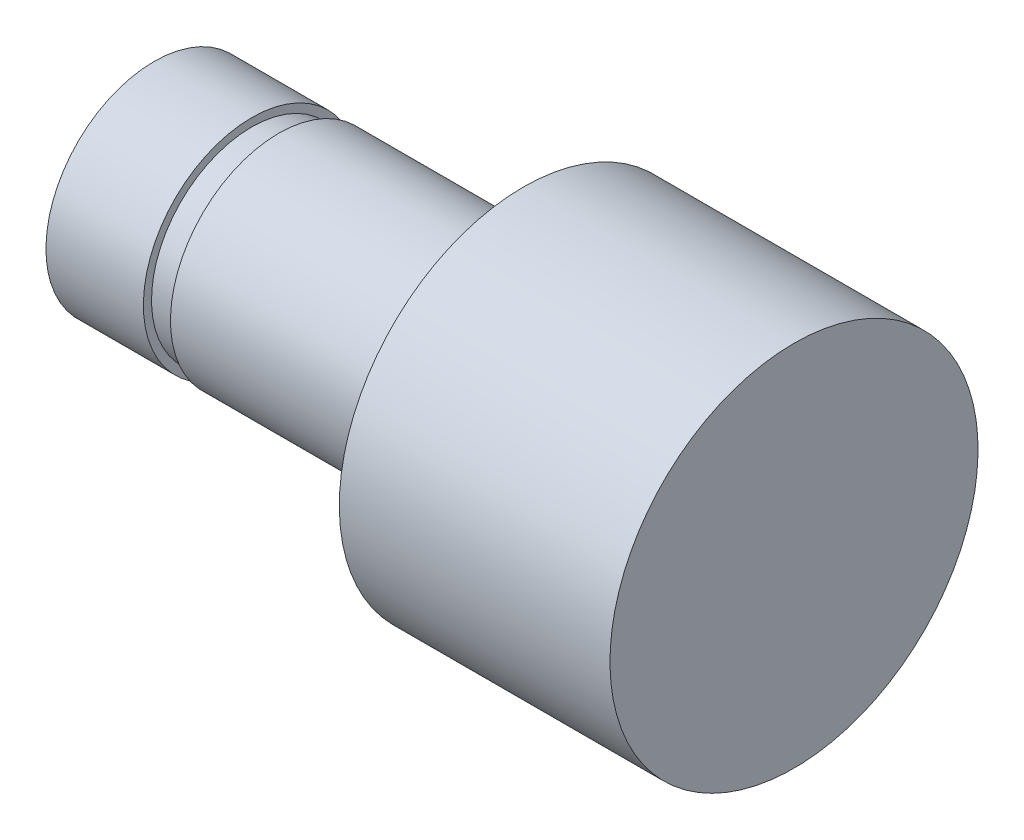
ISO-10303-21;
HEADER;
FILE_DESCRIPTION(('STEP AP214'),'2;1');
FILE_NAME('part.step','',(''),(''),'','','');
FILE_SCHEMA(('AUTOMOTIVE_DESIGN { 1 0 10303 214 1 1 1 1 }'));
ENDSEC;
DATA;
#1=APPLICATION_CONTEXT('core data for automotive mechanical design processes');
#2=APPLICATION_PROTOCOL_DEFINITION('international standard','automotive_design',2000,#1);
#3=PRODUCT_CONTEXT('',#1,'mechanical');
#4=PRODUCT('Part','Part','',(#3));
#5=PRODUCT_RELATED_PRODUCT_CATEGORY('part','',(#4));
#6=PRODUCT_DEFINITION_FORMATION('','',#4);
#7=PRODUCT_DEFINITION_CONTEXT('part definition',#1,'design');
#8=PRODUCT_DEFINITION('design','',#6,#7);
#9=PRODUCT_DEFINITION_SHAPE('','',#8);
#10=(LENGTH_UNIT() NAMED_UNIT(*) SI_UNIT(.MILLI.,.METRE.));
#11=(NAMED_UNIT(*) PLANE_ANGLE_UNIT() SI_UNIT($,.RADIAN.));
#12=(NAMED_UNIT(*) SI_UNIT($,.STERADIAN.) SOLID_ANGLE_UNIT());
#13=UNCERTAINTY_MEASURE_WITH_UNIT(LENGTH_MEASURE(1.E-05),#10,'distance_accuracy_value','');
#14=(GEOMETRIC_REPRESENTATION_CONTEXT(3) GLOBAL_UNCERTAINTY_ASSIGNED_CONTEXT((#13)) GLOBAL_UNIT_ASSIGNED_CONTEXT((#10,
#11,#12)) REPRESENTATION_CONTEXT('',''));
#15=CARTESIAN_POINT('',(0.,0.,0.));
#16=DIRECTION('',(0.,0.,1.));
#17=DIRECTION('',(1.,0.,0.));
#18=AXIS2_PLACEMENT_3D('',#15,#16,#17);
#19=CARTESIAN_POINT('',(2.65645161290323,3.4,0.));
#20=DIRECTION('',(1.,0.,0.));
#21=DIRECTION('',(0.,1.,0.));
#22=AXIS2_PLACEMENT_3D('',#19,#20,#21);
#23=PLANE('',#22);
#24=CARTESIAN_POINT('',(2.65645161290323,0.,0.));
#25=DIRECTION('',(1.,0.,0.));
#26=DIRECTION('',(0.,1.,0.));
#27=AXIS2_PLACEMENT_3D('',#24,#25,#26);
#28=CIRCLE('',#27,3.4);
#29=CARTESIAN_POINT('',(2.65645161290323,3.4,0.));
#30=VERTEX_POINT('',#29);
#31=EDGE_CURVE('E67',#30,#30,#28,.T.);
#32=ORIENTED_EDGE('',*,*,#31,.T.);
#33=EDGE_LOOP('',(#32));
#34=FACE_BOUND('',#33,.T.);
#35=ADVANCED_FACE('F39',(#34),#23,.T.);
#36=CARTESIAN_POINT('',(-9.16354838709677,0.,0.));
#37=DIRECTION('',(-1.,0.,0.));
#38=DIRECTION('',(0.,-1.,0.));
#39=AXIS2_PLACEMENT_3D('',#36,#37,#38);
#40=PLANE('',#39);
#41=CARTESIAN_POINT('',(-9.16354838709677,0.,0.));
#42=DIRECTION('',(1.,0.,0.));
#43=DIRECTION('',(0.,1.,0.));
#44=AXIS2_PLACEMENT_3D('',#41,#42,#43);
#45=CIRCLE('',#44,2.);
#46=CARTESIAN_POINT('',(-9.16354838709677,2.,0.));
#47=VERTEX_POINT('',#46);
#48=EDGE_CURVE('E10',#47,#47,#45,.T.);
#49=ORIENTED_EDGE('',*,*,#48,.F.);
#50=EDGE_LOOP('',(#49));
#51=FACE_BOUND('',#50,.T.);
#52=ADVANCED_FACE('F84',(#51),#40,.T.);
#53=CARTESIAN_POINT('',(2.65645161290323,0.,0.));
#54=DIRECTION('',(1.,0.,0.));
#55=DIRECTION('',(0.,1.,0.));
#56=AXIS2_PLACEMENT_3D('',#53,#54,#55);
#57=CYLINDRICAL_SURFACE('',#56,2.);
#58=ORIENTED_EDGE('',*,*,#48,.T.);
#59=EDGE_LOOP('',(#58));
#60=FACE_BOUND('',#59,.T.);
#61=CARTESIAN_POINT('',(-7.36354838709677,0.,0.));
#62=DIRECTION('',(1.,0.,0.));
#63=DIRECTION('',(0.,1.,0.));
#64=AXIS2_PLACEMENT_3D('',#61,#62,#63);
#65=CIRCLE('',#64,2.);
#66=CARTESIAN_POINT('',(-7.36354838709677,2.,0.));
#67=VERTEX_POINT('',#66);
#68=EDGE_CURVE('E45',#67,#67,#65,.T.);
#69=ORIENTED_EDGE('',*,*,#68,.F.);
#70=EDGE_LOOP('',(#69));
#71=FACE_BOUND('',#70,.T.);
#72=ADVANCED_FACE('F88',(#60,#71),#57,.T.);
#73=CARTESIAN_POINT('',(-7.36354838709677,2.,0.));
#74=DIRECTION('',(1.,0.,0.));
#75=DIRECTION('',(0.,1.,0.));
#76=AXIS2_PLACEMENT_3D('',#73,#74,#75);
#77=PLANE('',#76);
#78=ORIENTED_EDGE('',*,*,#68,.T.);
#79=EDGE_LOOP('',(#78));
#80=FACE_BOUND('',#79,.T.);
#81=CARTESIAN_POINT('',(-7.36354838709677,0.,0.));
#82=DIRECTION('',(1.,0.,0.));
#83=DIRECTION('',(0.,1.,0.));
#84=AXIS2_PLACEMENT_3D('',#81,#82,#83);
#85=CIRCLE('',#84,1.85);
#86=CARTESIAN_POINT('',(-7.36354838709677,1.85,0.));
#87=VERTEX_POINT('',#86);
#88=EDGE_CURVE('E49',#87,#87,#85,.T.);
#89=ORIENTED_EDGE('',*,*,#88,.F.);
#90=EDGE_LOOP('',(#89));
#91=FACE_BOUND('',#90,.T.);
#92=ADVANCED_FACE('F93',(#80,#91),#77,.T.);
#93=CARTESIAN_POINT('',(2.65645161290323,0.,0.));
#94=DIRECTION('',(1.,0.,0.));
#95=DIRECTION('',(0.,1.,0.));
#96=AXIS2_PLACEMENT_3D('',#93,#94,#95);
#97=CYLINDRICAL_SURFACE('',#96,1.85);
#98=ORIENTED_EDGE('',*,*,#88,.T.);
#99=EDGE_LOOP('',(#98));
#100=FACE_BOUND('',#99,.T.);
#101=CARTESIAN_POINT('',(-6.86354838709677,0.,0.));
#102=DIRECTION('',(1.,0.,0.));
#103=DIRECTION('',(0.,1.,0.));
#104=AXIS2_PLACEMENT_3D('',#101,#102,#103);
#105=CIRCLE('',#104,1.85);
#106=CARTESIAN_POINT('',(-6.86354838709677,1.85,0.));
#107=VERTEX_POINT('',#106);
#108=EDGE_CURVE('E53',#107,#107,#105,.T.);
#109=ORIENTED_EDGE('',*,*,#108,.F.);
#110=EDGE_LOOP('',(#109));
#111=FACE_BOUND('',#110,.T.);
#112=ADVANCED_FACE('F98',(#100,#111),#97,.T.);
#113=CARTESIAN_POINT('',(-6.86354838709677,1.85,0.));
#114=DIRECTION('',(-1.,0.,0.));
#115=DIRECTION('',(0.,-1.,0.));
#116=AXIS2_PLACEMENT_3D('',#113,#114,#115);
#117=PLANE('',#116);
#118=ORIENTED_EDGE('',*,*,#108,.T.);
#119=EDGE_LOOP('',(#118));
#120=FACE_BOUND('',#119,.T.);
#121=CARTESIAN_POINT('',(-6.86354838709677,0.,0.));
#122=DIRECTION('',(1.,0.,0.));
#123=DIRECTION('',(0.,1.,0.));
#124=AXIS2_PLACEMENT_3D('',#121,#122,#123);
#125=CIRCLE('',#124,2.);
#126=CARTESIAN_POINT('',(-6.86354838709677,2.,0.));
#127=VERTEX_POINT('',#126);
#128=EDGE_CURVE('E58',#127,#127,#125,.T.);
#129=ORIENTED_EDGE('',*,*,#128,.F.);
#130=EDGE_LOOP('',(#129));
#131=FACE_BOUND('',#130,.T.);
#132=ADVANCED_FACE('F101',(#120,#131),#117,.T.);
#133=CARTESIAN_POINT('',(2.65645161290323,0.,0.));
#134=DIRECTION('',(1.,0.,0.));
#135=DIRECTION('',(0.,1.,0.));
#136=AXIS2_PLACEMENT_3D('',#133,#134,#135);
#137=CYLINDRICAL_SURFACE('',#136,2.);
#138=ORIENTED_EDGE('',*,*,#128,.T.);
#139=EDGE_LOOP('',(#138));
#140=FACE_BOUND('',#139,.T.);
#141=CARTESIAN_POINT('',(-2.34354838709677,0.,0.));
#142=DIRECTION('',(1.,0.,0.));
#143=DIRECTION('',(0.,1.,0.));
#144=AXIS2_PLACEMENT_3D('',#141,#142,#143);
#145=CIRCLE('',#144,2.);
#146=CARTESIAN_POINT('',(-2.34354838709677,2.,0.));
#147=VERTEX_POINT('',#146);
#148=EDGE_CURVE('E61',#147,#147,#145,.T.);
#149=ORIENTED_EDGE('',*,*,#148,.F.);
#150=EDGE_LOOP('',(#149));
#151=FACE_BOUND('',#150,.T.);
#152=ADVANCED_FACE('F80',(#140,#151),#137,.T.);
#153=CARTESIAN_POINT('',(-2.34354838709677,2.,0.));
#154=DIRECTION('',(-1.,0.,0.));
#155=DIRECTION('',(0.,-1.,0.));
#156=AXIS2_PLACEMENT_3D('',#153,#154,#155);
#157=PLANE('',#156);
#158=ORIENTED_EDGE('',*,*,#148,.T.);
#159=EDGE_LOOP('',(#158));
#160=FACE_BOUND('',#159,.T.);
#161=CARTESIAN_POINT('',(-2.34354838709677,0.,0.));
#162=DIRECTION('',(1.,0.,0.));
#163=DIRECTION('',(0.,1.,0.));
#164=AXIS2_PLACEMENT_3D('',#161,#162,#163);
#165=CIRCLE('',#164,3.4);
#166=CARTESIAN_POINT('',(-2.34354838709677,3.4,0.));
#167=VERTEX_POINT('',#166);
#168=EDGE_CURVE('E64',#167,#167,#165,.T.);
#169=ORIENTED_EDGE('',*,*,#168,.F.);
#170=EDGE_LOOP('',(#169));
#171=FACE_BOUND('',#170,.T.);
#172=ADVANCED_FACE('F74',(#160,#171),#157,.T.);
#173=CARTESIAN_POINT('',(2.65645161290323,0.,0.));
#174=DIRECTION('',(1.,0.,0.));
#175=DIRECTION('',(0.,1.,0.));
#176=AXIS2_PLACEMENT_3D('',#173,#174,#175);
#177=CYLINDRICAL_SURFACE('',#176,3.4);
#178=ORIENTED_EDGE('',*,*,#168,.T.);
#179=EDGE_LOOP('',(#178));
#180=FACE_BOUND('',#179,.T.);
#181=ORIENTED_EDGE('',*,*,#31,.F.);
#182=EDGE_LOOP('',(#181));
#183=FACE_BOUND('',#182,.T.);
#184=ADVANCED_FACE('F72',(#180,#183),#177,.T.);
#185=CLOSED_SHELL('',(#35,#52,#72,#92,#112,#132,#152,#172,#184));
#186=MANIFOLD_SOLID_BREP('B2',#185);
#187=ADVANCED_BREP_SHAPE_REPRESENTATION('',(#18,#186),#14);
#188=SHAPE_DEFINITION_REPRESENTATION(#9,#187);
ENDSEC;
END-ISO-10303-21;
